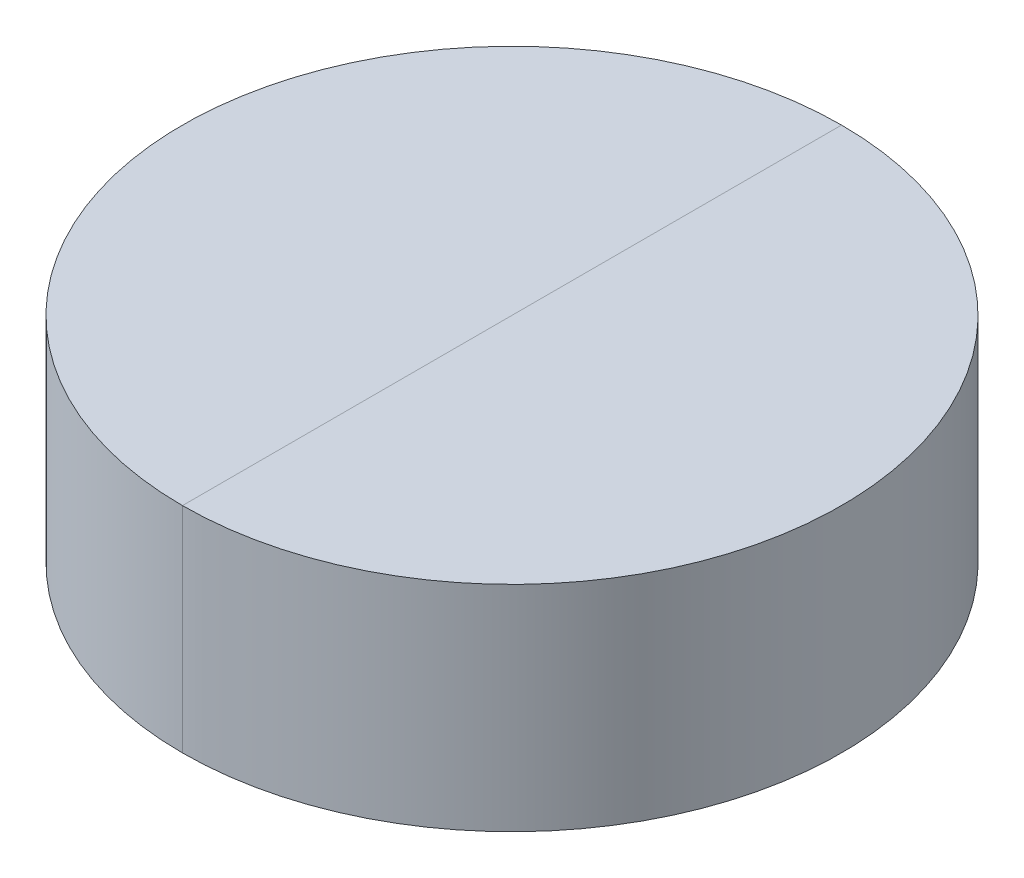
ISO-10303-21;
HEADER;
FILE_DESCRIPTION(('STEP AP214'),'2;1');
FILE_NAME('part.step','',(''),(''),'','','');
FILE_SCHEMA(('AUTOMOTIVE_DESIGN { 1 0 10303 214 1 1 1 1 }'));
ENDSEC;
DATA;
#1=APPLICATION_CONTEXT('core data for automotive mechanical design processes');
#2=APPLICATION_PROTOCOL_DEFINITION('international standard','automotive_design',2000,#1);
#3=PRODUCT_CONTEXT('',#1,'mechanical');
#4=PRODUCT('Part','Part','',(#3));
#5=PRODUCT_RELATED_PRODUCT_CATEGORY('part','',(#4));
#6=PRODUCT_DEFINITION_FORMATION('','',#4);
#7=PRODUCT_DEFINITION_CONTEXT('part definition',#1,'design');
#8=PRODUCT_DEFINITION('design','',#6,#7);
#9=PRODUCT_DEFINITION_SHAPE('','',#8);
#10=(LENGTH_UNIT() NAMED_UNIT(*) SI_UNIT(.MILLI.,.METRE.));
#11=(NAMED_UNIT(*) PLANE_ANGLE_UNIT() SI_UNIT($,.RADIAN.));
#12=(NAMED_UNIT(*) SI_UNIT($,.STERADIAN.) SOLID_ANGLE_UNIT());
#13=UNCERTAINTY_MEASURE_WITH_UNIT(LENGTH_MEASURE(1.E-05),#10,'distance_accuracy_value','');
#14=(GEOMETRIC_REPRESENTATION_CONTEXT(3) GLOBAL_UNCERTAINTY_ASSIGNED_CONTEXT((#13)) GLOBAL_UNIT_ASSIGNED_CONTEXT((#10,
#11,#12)) REPRESENTATION_CONTEXT('',''));
#15=CARTESIAN_POINT('',(0.,0.,0.));
#16=DIRECTION('',(0.,0.,1.));
#17=DIRECTION('',(1.,0.,0.));
#18=AXIS2_PLACEMENT_3D('',#15,#16,#17);
#19=CARTESIAN_POINT('',(0.,11.5442719099992,0.));
#20=DIRECTION('',(0.,-1.,0.));
#21=DIRECTION('',(0.,0.,-1.));
#22=AXIS2_PLACEMENT_3D('',#19,#20,#21);
#23=CYLINDRICAL_SURFACE('',#22,4.);
#24=CARTESIAN_POINT('',(0.,2.6,0.));
#25=DIRECTION('',(0.,1.,0.));
#26=DIRECTION('',(0.,0.,1.));
#27=AXIS2_PLACEMENT_3D('',#24,#25,#26);
#28=CIRCLE('',#27,4.);
#29=CARTESIAN_POINT('',(0.,2.6,4.));
#30=VERTEX_POINT('',#29);
#31=CARTESIAN_POINT('',(0.,2.6,-4.));
#32=VERTEX_POINT('',#31);
#33=EDGE_CURVE('E12',#30,#32,#28,.T.);
#34=ORIENTED_EDGE('',*,*,#33,.F.);
#35=DIRECTION('',(0.,-1.,0.));
#36=VECTOR('',#35,1.);
#37=CARTESIAN_POINT('',(0.,11.5442719099992,4.));
#38=LINE('',#37,#36);
#39=CARTESIAN_POINT('',(0.,0.,4.));
#40=VERTEX_POINT('',#39);
#41=EDGE_CURVE('E46',#30,#40,#38,.T.);
#42=ORIENTED_EDGE('',*,*,#41,.T.);
#43=CARTESIAN_POINT('',(0.,0.,0.));
#44=DIRECTION('',(0.,1.,0.));
#45=DIRECTION('',(0.,0.,1.));
#46=AXIS2_PLACEMENT_3D('',#43,#44,#45);
#47=CIRCLE('',#46,4.);
#48=CARTESIAN_POINT('',(0.,0.,-4.));
#49=VERTEX_POINT('',#48);
#50=EDGE_CURVE('E71',#40,#49,#47,.T.);
#51=ORIENTED_EDGE('',*,*,#50,.T.);
#52=DIRECTION('',(0.,-1.,0.));
#53=VECTOR('',#52,1.);
#54=CARTESIAN_POINT('',(0.,11.5442719099992,-4.));
#55=LINE('',#54,#53);
#56=EDGE_CURVE('E63',#32,#49,#55,.T.);
#57=ORIENTED_EDGE('',*,*,#56,.F.);
#58=EDGE_LOOP('',(#34,#42,#51,#57));
#59=FACE_BOUND('',#58,.T.);
#60=ADVANCED_FACE('F42',(#59),#23,.T.);
#61=CARTESIAN_POINT('',(0.,11.5442719099992,4.));
#62=DIRECTION('',(1.,0.,0.));
#63=DIRECTION('',(0.,0.,-1.));
#64=AXIS2_PLACEMENT_3D('',#61,#62,#63);
#65=PLANE('',#64);
#66=DIRECTION('',(0.,0.,1.));
#67=VECTOR('',#66,1.);
#68=CARTESIAN_POINT('',(0.,2.6,4.));
#69=LINE('',#68,#67);
#70=EDGE_CURVE('E51',#32,#30,#69,.T.);
#71=ORIENTED_EDGE('',*,*,#70,.F.);
#72=ORIENTED_EDGE('',*,*,#56,.T.);
#73=DIRECTION('',(0.,0.,1.));
#74=VECTOR('',#73,1.);
#75=CARTESIAN_POINT('',(0.,0.,4.));
#76=LINE('',#75,#74);
#77=EDGE_CURVE('E73',#49,#40,#76,.T.);
#78=ORIENTED_EDGE('',*,*,#77,.T.);
#79=ORIENTED_EDGE('',*,*,#41,.F.);
#80=EDGE_LOOP('',(#71,#72,#78,#79));
#81=FACE_BOUND('',#80,.T.);
#82=ADVANCED_FACE('F74',(#81),#65,.F.);
#83=CARTESIAN_POINT('',(0.,0.,0.));
#84=DIRECTION('',(0.,1.,0.));
#85=DIRECTION('',(0.,0.,1.));
#86=AXIS2_PLACEMENT_3D('',#83,#84,#85);
#87=PLANE('',#86);
#88=ORIENTED_EDGE('',*,*,#50,.F.);
#89=ORIENTED_EDGE('',*,*,#77,.F.);
#90=EDGE_LOOP('',(#88,#89));
#91=FACE_BOUND('',#90,.T.);
#92=ADVANCED_FACE('F77',(#91),#87,.F.);
#93=CARTESIAN_POINT('',(0.,2.6,0.));
#94=DIRECTION('',(0.,1.,0.));
#95=DIRECTION('',(0.,0.,1.));
#96=AXIS2_PLACEMENT_3D('',#93,#94,#95);
#97=PLANE('',#96);
#98=ORIENTED_EDGE('',*,*,#70,.T.);
#99=ORIENTED_EDGE('',*,*,#33,.T.);
#100=EDGE_LOOP('',(#98,#99));
#101=FACE_BOUND('',#100,.T.);
#102=ADVANCED_FACE('F44',(#101),#97,.T.);
#103=CLOSED_SHELL('',(#60,#82,#92,#102));
#104=MANIFOLD_SOLID_BREP('B2',#103);
#105=CARTESIAN_POINT('',(0.,2.6,0.));
#106=DIRECTION('',(0.,-1.,0.));
#107=DIRECTION('',(0.,0.,-1.));
#108=AXIS2_PLACEMENT_3D('',#105,#106,#107);
#109=CYLINDRICAL_SURFACE('',#108,4.);
#110=CARTESIAN_POINT('',(0.,0.,0.));
#111=DIRECTION('',(0.,1.,0.));
#112=DIRECTION('',(0.,0.,1.));
#113=AXIS2_PLACEMENT_3D('',#110,#111,#112);
#114=CIRCLE('',#113,4.);
#115=CARTESIAN_POINT('',(0.,0.,-4.));
#116=VERTEX_POINT('',#115);
#117=CARTESIAN_POINT('',(0.,0.,4.));
#118=VERTEX_POINT('',#117);
#119=EDGE_CURVE('E144',#116,#118,#114,.T.);
#120=ORIENTED_EDGE('',*,*,#119,.T.);
#121=DIRECTION('',(0.,-1.,0.));
#122=VECTOR('',#121,1.);
#123=CARTESIAN_POINT('',(0.,2.6,4.));
#124=LINE('',#123,#122);
#125=CARTESIAN_POINT('',(0.,2.6,4.));
#126=VERTEX_POINT('',#125);
#127=EDGE_CURVE('E40',#126,#118,#124,.T.);
#128=ORIENTED_EDGE('',*,*,#127,.F.);
#129=CARTESIAN_POINT('',(0.,2.6,0.));
#130=DIRECTION('',(0.,1.,0.));
#131=DIRECTION('',(0.,0.,1.));
#132=AXIS2_PLACEMENT_3D('',#129,#130,#131);
#133=CIRCLE('',#132,4.);
#134=CARTESIAN_POINT('',(0.,2.6,-4.));
#135=VERTEX_POINT('',#134);
#136=EDGE_CURVE('E143',#135,#126,#133,.T.);
#137=ORIENTED_EDGE('',*,*,#136,.F.);
#138=DIRECTION('',(0.,-1.,0.));
#139=VECTOR('',#138,1.);
#140=CARTESIAN_POINT('',(0.,2.6,-4.));
#141=LINE('',#140,#139);
#142=EDGE_CURVE('E121',#135,#116,#141,.T.);
#143=ORIENTED_EDGE('',*,*,#142,.T.);
#144=EDGE_LOOP('',(#120,#128,#137,#143));
#145=FACE_BOUND('',#144,.T.);
#146=ADVANCED_FACE('F113',(#145),#109,.T.);
#147=CARTESIAN_POINT('',(0.,2.6,-4.));
#148=DIRECTION('',(-1.,0.,0.));
#149=DIRECTION('',(0.,0.,1.));
#150=AXIS2_PLACEMENT_3D('',#147,#148,#149);
#151=PLANE('',#150);
#152=DIRECTION('',(0.,0.,-1.));
#153=VECTOR('',#152,1.);
#154=CARTESIAN_POINT('',(0.,0.,-4.));
#155=LINE('',#154,#153);
#156=EDGE_CURVE('E136',#118,#116,#155,.T.);
#157=ORIENTED_EDGE('',*,*,#156,.T.);
#158=ORIENTED_EDGE('',*,*,#142,.F.);
#159=DIRECTION('',(0.,0.,-1.));
#160=VECTOR('',#159,1.);
#161=CARTESIAN_POINT('',(0.,2.6,-4.));
#162=LINE('',#161,#160);
#163=EDGE_CURVE('E128',#126,#135,#162,.T.);
#164=ORIENTED_EDGE('',*,*,#163,.F.);
#165=ORIENTED_EDGE('',*,*,#127,.T.);
#166=EDGE_LOOP('',(#157,#158,#164,#165));
#167=FACE_BOUND('',#166,.T.);
#168=ADVANCED_FACE('F139',(#167),#151,.F.);
#169=CARTESIAN_POINT('',(0.,2.6,0.));
#170=DIRECTION('',(0.,1.,0.));
#171=DIRECTION('',(0.,0.,1.));
#172=AXIS2_PLACEMENT_3D('',#169,#170,#171);
#173=PLANE('',#172);
#174=ORIENTED_EDGE('',*,*,#136,.T.);
#175=ORIENTED_EDGE('',*,*,#163,.T.);
#176=EDGE_LOOP('',(#174,#175));
#177=FACE_BOUND('',#176,.T.);
#178=ADVANCED_FACE('F151',(#177),#173,.T.);
#179=CARTESIAN_POINT('',(0.,0.,0.));
#180=DIRECTION('',(0.,1.,0.));
#181=DIRECTION('',(0.,0.,1.));
#182=AXIS2_PLACEMENT_3D('',#179,#180,#181);
#183=PLANE('',#182);
#184=ORIENTED_EDGE('',*,*,#119,.F.);
#185=ORIENTED_EDGE('',*,*,#156,.F.);
#186=EDGE_LOOP('',(#184,#185));
#187=FACE_BOUND('',#186,.T.);
#188=ADVANCED_FACE('F147',(#187),#183,.F.);
#189=CLOSED_SHELL('',(#146,#168,#178,#188));
#190=MANIFOLD_SOLID_BREP('B6',#189);
#191=ADVANCED_BREP_SHAPE_REPRESENTATION('',(#18,#104,#190),#14);
#192=SHAPE_DEFINITION_REPRESENTATION(#9,#191);
ENDSEC;
END-ISO-10303-21;
